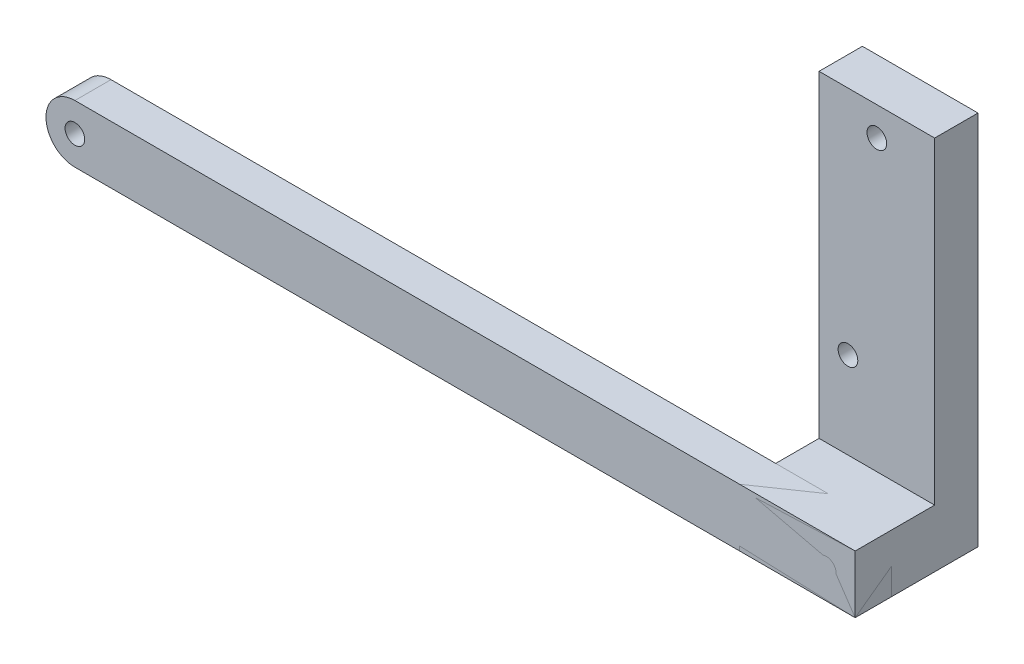
ISO-10303-21;
HEADER;
FILE_DESCRIPTION(('STEP AP214'),'2;1');
FILE_NAME('part.step','',(''),(''),'','','');
FILE_SCHEMA(('AUTOMOTIVE_DESIGN { 1 0 10303 214 1 1 1 1 }'));
ENDSEC;
DATA;
#1=APPLICATION_CONTEXT('core data for automotive mechanical design processes');
#2=APPLICATION_PROTOCOL_DEFINITION('international standard','automotive_design',2000,#1);
#3=PRODUCT_CONTEXT('',#1,'mechanical');
#4=PRODUCT('Part','Part','',(#3));
#5=PRODUCT_RELATED_PRODUCT_CATEGORY('part','',(#4));
#6=PRODUCT_DEFINITION_FORMATION('','',#4);
#7=PRODUCT_DEFINITION_CONTEXT('part definition',#1,'design');
#8=PRODUCT_DEFINITION('design','',#6,#7);
#9=PRODUCT_DEFINITION_SHAPE('','',#8);
#10=(LENGTH_UNIT() NAMED_UNIT(*) SI_UNIT(.MILLI.,.METRE.));
#11=(NAMED_UNIT(*) PLANE_ANGLE_UNIT() SI_UNIT($,.RADIAN.));
#12=(NAMED_UNIT(*) SI_UNIT($,.STERADIAN.) SOLID_ANGLE_UNIT());
#13=UNCERTAINTY_MEASURE_WITH_UNIT(LENGTH_MEASURE(1.E-05),#10,'distance_accuracy_value','');
#14=(GEOMETRIC_REPRESENTATION_CONTEXT(3) GLOBAL_UNCERTAINTY_ASSIGNED_CONTEXT((#13)) GLOBAL_UNIT_ASSIGNED_CONTEXT((#10,
#11,#12)) REPRESENTATION_CONTEXT('',''));
#15=CARTESIAN_POINT('',(0.,0.,0.));
#16=DIRECTION('',(0.,0.,1.));
#17=DIRECTION('',(1.,0.,0.));
#18=AXIS2_PLACEMENT_3D('',#15,#16,#17);
#19=CARTESIAN_POINT('',(0.,0.,-9.525));
#20=DIRECTION('',(0.,0.,-1.));
#21=DIRECTION('',(1.,0.,0.));
#22=AXIS2_PLACEMENT_3D('',#19,#20,#21);
#23=PLANE('',#22);
#24=CARTESIAN_POINT('',(-6.35,-44.45,-9.525));
#25=DIRECTION('',(0.,0.,1.));
#26=DIRECTION('',(1.,0.,0.));
#27=AXIS2_PLACEMENT_3D('',#24,#25,#26);
#28=CIRCLE('',#27,2.159);
#29=CARTESIAN_POINT('',(-8.50900000000001,-44.45,-9.525));
#30=VERTEX_POINT('',#29);
#31=EDGE_CURVE('E141',#30,#30,#28,.T.);
#32=ORIENTED_EDGE('',*,*,#31,.T.);
#33=EDGE_LOOP('',(#32));
#34=FACE_BOUND('',#33,.T.);
#35=DIRECTION('',(0.,-1.,0.));
#36=VECTOR('',#35,1.);
#37=CARTESIAN_POINT('',(-12.7,6.35,-9.525));
#38=LINE('',#37,#36);
#39=CARTESIAN_POINT('',(-12.7,6.35,-9.525));
#40=VERTEX_POINT('',#39);
#41=CARTESIAN_POINT('',(-12.7,-76.2,-9.525));
#42=VERTEX_POINT('',#41);
#43=EDGE_CURVE('E153',#40,#42,#38,.T.);
#44=ORIENTED_EDGE('',*,*,#43,.F.);
#45=DIRECTION('',(-1.,0.,0.));
#46=VECTOR('',#45,1.);
#47=CARTESIAN_POINT('',(-12.7,6.35,-9.525));
#48=LINE('',#47,#46);
#49=CARTESIAN_POINT('',(12.7,6.34999999999999,-9.525));
#50=VERTEX_POINT('',#49);
#51=EDGE_CURVE('E161',#50,#40,#48,.T.);
#52=ORIENTED_EDGE('',*,*,#51,.F.);
#53=DIRECTION('',(0.,1.,0.));
#54=VECTOR('',#53,1.);
#55=CARTESIAN_POINT('',(12.7,6.34999999999999,-9.525));
#56=LINE('',#55,#54);
#57=CARTESIAN_POINT('',(12.7,-76.2,-9.525));
#58=VERTEX_POINT('',#57);
#59=EDGE_CURVE('E158',#58,#50,#56,.T.);
#60=ORIENTED_EDGE('',*,*,#59,.F.);
#61=DIRECTION('',(1.,0.,0.));
#62=VECTOR('',#61,1.);
#63=CARTESIAN_POINT('',(-12.7,-76.2,-9.525));
#64=LINE('',#63,#62);
#65=EDGE_CURVE('E155',#42,#58,#64,.T.);
#66=ORIENTED_EDGE('',*,*,#65,.F.);
#67=EDGE_LOOP('',(#44,#52,#60,#66));
#68=FACE_BOUND('',#67,.T.);
#69=CARTESIAN_POINT('',(0.,0.,-9.525));
#70=DIRECTION('',(0.,0.,1.));
#71=DIRECTION('',(1.,0.,0.));
#72=AXIS2_PLACEMENT_3D('',#69,#70,#71);
#73=CIRCLE('',#72,2.159);
#74=CARTESIAN_POINT('',(-2.159,0.,-9.525));
#75=VERTEX_POINT('',#74);
#76=EDGE_CURVE('E147',#75,#75,#73,.T.);
#77=ORIENTED_EDGE('',*,*,#76,.T.);
#78=EDGE_LOOP('',(#77));
#79=FACE_BOUND('',#78,.T.);
#80=CARTESIAN_POINT('',(6.35,-69.85,-9.525));
#81=DIRECTION('',(0.,0.,1.));
#82=DIRECTION('',(1.,0.,0.));
#83=AXIS2_PLACEMENT_3D('',#80,#81,#82);
#84=CIRCLE('',#83,2.159);
#85=CARTESIAN_POINT('',(4.191,-69.85,-9.525));
#86=VERTEX_POINT('',#85);
#87=EDGE_CURVE('E133',#86,#86,#84,.T.);
#88=ORIENTED_EDGE('',*,*,#87,.T.);
#89=EDGE_LOOP('',(#88));
#90=FACE_BOUND('',#89,.T.);
#91=ADVANCED_FACE('F53',(#34,#68,#79,#90),#23,.T.);
#92=CARTESIAN_POINT('',(0.,0.,0.));
#93=DIRECTION('',(0.,0.,-1.));
#94=DIRECTION('',(1.,0.,0.));
#95=AXIS2_PLACEMENT_3D('',#92,#93,#94);
#96=PLANE('',#95);
#97=DIRECTION('',(0.,1.,0.));
#98=VECTOR('',#97,1.);
#99=CARTESIAN_POINT('',(12.7,6.34999999999999,0.));
#100=LINE('',#99,#98);
#101=CARTESIAN_POINT('',(12.7000000000005,-63.500000000002,0.));
#102=VERTEX_POINT('',#101);
#103=CARTESIAN_POINT('',(12.7,6.34999999999999,0.));
#104=VERTEX_POINT('',#103);
#105=EDGE_CURVE('E132',#102,#104,#100,.T.);
#106=ORIENTED_EDGE('',*,*,#105,.T.);
#107=DIRECTION('',(-1.,0.,0.));
#108=VECTOR('',#107,1.);
#109=CARTESIAN_POINT('',(-12.7,6.35,0.));
#110=LINE('',#109,#108);
#111=CARTESIAN_POINT('',(-12.7,6.35,0.));
#112=VERTEX_POINT('',#111);
#113=EDGE_CURVE('E156',#104,#112,#110,.T.);
#114=ORIENTED_EDGE('',*,*,#113,.T.);
#115=DIRECTION('',(0.,-1.,0.));
#116=VECTOR('',#115,1.);
#117=CARTESIAN_POINT('',(-12.7,6.35,0.));
#118=LINE('',#117,#116);
#119=CARTESIAN_POINT('',(-12.7,-63.500000000002,0.));
#120=VERTEX_POINT('',#119);
#121=EDGE_CURVE('E150',#112,#120,#118,.T.);
#122=ORIENTED_EDGE('',*,*,#121,.T.);
#123=DIRECTION('',(-1.,0.,0.));
#124=VECTOR('',#123,1.);
#125=CARTESIAN_POINT('',(12.7000000000005,-63.500000000002,0.));
#126=LINE('',#125,#124);
#127=EDGE_CURVE('E180',#102,#120,#126,.T.);
#128=ORIENTED_EDGE('',*,*,#127,.F.);
#129=EDGE_LOOP('',(#106,#114,#122,#128));
#130=FACE_BOUND('',#129,.T.);
#131=CARTESIAN_POINT('',(0.,0.,0.));
#132=DIRECTION('',(0.,0.,1.));
#133=DIRECTION('',(1.,0.,0.));
#134=AXIS2_PLACEMENT_3D('',#131,#132,#133);
#135=CIRCLE('',#134,2.159);
#136=CARTESIAN_POINT('',(-2.159,0.,0.));
#137=VERTEX_POINT('',#136);
#138=EDGE_CURVE('E144',#137,#137,#135,.T.);
#139=ORIENTED_EDGE('',*,*,#138,.F.);
#140=EDGE_LOOP('',(#139));
#141=FACE_BOUND('',#140,.T.);
#142=CARTESIAN_POINT('',(-6.35,-44.45,0.));
#143=DIRECTION('',(0.,0.,1.));
#144=DIRECTION('',(1.,0.,0.));
#145=AXIS2_PLACEMENT_3D('',#142,#143,#144);
#146=CIRCLE('',#145,2.159);
#147=CARTESIAN_POINT('',(-8.50900000000001,-44.45,0.));
#148=VERTEX_POINT('',#147);
#149=EDGE_CURVE('E136',#148,#148,#146,.T.);
#150=ORIENTED_EDGE('',*,*,#149,.F.);
#151=EDGE_LOOP('',(#150));
#152=FACE_BOUND('',#151,.T.);
#153=ADVANCED_FACE('F178',(#130,#141,#152),#96,.F.);
#154=CARTESIAN_POINT('',(-12.7,6.35,-9.525));
#155=DIRECTION('',(1.,0.,0.));
#156=DIRECTION('',(0.,1.,0.));
#157=AXIS2_PLACEMENT_3D('',#154,#155,#156);
#158=PLANE('',#157);
#159=ORIENTED_EDGE('',*,*,#121,.F.);
#160=DIRECTION('',(0.,0.,1.));
#161=VECTOR('',#160,1.);
#162=CARTESIAN_POINT('',(-12.7,6.35,-9.525));
#163=LINE('',#162,#161);
#164=EDGE_CURVE('E75',#40,#112,#163,.T.);
#165=ORIENTED_EDGE('',*,*,#164,.F.);
#166=ORIENTED_EDGE('',*,*,#43,.T.);
#167=DIRECTION('',(0.,0.,1.));
#168=VECTOR('',#167,1.);
#169=CARTESIAN_POINT('',(-12.7,-76.2,-9.525));
#170=LINE('',#169,#168);
#171=CARTESIAN_POINT('',(-12.7,-76.2,17.4625));
#172=VERTEX_POINT('',#171);
#173=EDGE_CURVE('E12',#42,#172,#170,.T.);
#174=ORIENTED_EDGE('',*,*,#173,.T.);
#175=DIRECTION('',(0.,-1.,0.));
#176=VECTOR('',#175,1.);
#177=CARTESIAN_POINT('',(-12.6999999999995,-63.500000000002,17.4625));
#178=LINE('',#177,#176);
#179=CARTESIAN_POINT('',(-12.6999999999995,-63.500000000002,17.4625));
#180=VERTEX_POINT('',#179);
#181=EDGE_CURVE('E118',#180,#172,#178,.T.);
#182=ORIENTED_EDGE('',*,*,#181,.F.);
#183=DIRECTION('',(0.,0.,1.));
#184=VECTOR('',#183,1.);
#185=CARTESIAN_POINT('',(-12.6999999999995,-63.500000000002,-28.3980633142469));
#186=LINE('',#185,#184);
#187=EDGE_CURVE('E68',#120,#180,#186,.T.);
#188=ORIENTED_EDGE('',*,*,#187,.F.);
#189=EDGE_LOOP('',(#159,#165,#166,#174,#182,#188));
#190=FACE_BOUND('',#189,.T.);
#191=ADVANCED_FACE('F55',(#190),#158,.F.);
#192=CARTESIAN_POINT('',(-12.7,-76.2,-9.525));
#193=DIRECTION('',(0.,1.,0.));
#194=DIRECTION('',(0.,0.,-1.));
#195=AXIS2_PLACEMENT_3D('',#192,#193,#194);
#196=PLANE('',#195);
#197=ORIENTED_EDGE('',*,*,#173,.F.);
#198=ORIENTED_EDGE('',*,*,#65,.T.);
#199=DIRECTION('',(0.,0.,1.));
#200=VECTOR('',#199,1.);
#201=CARTESIAN_POINT('',(12.7,-76.2,-9.525));
#202=LINE('',#201,#200);
#203=CARTESIAN_POINT('',(12.7000000000005,-76.2,17.4625));
#204=VERTEX_POINT('',#203);
#205=EDGE_CURVE('E61',#58,#204,#202,.T.);
#206=ORIENTED_EDGE('',*,*,#205,.T.);
#207=DIRECTION('',(1.,0.,0.));
#208=VECTOR('',#207,1.);
#209=CARTESIAN_POINT('',(12.7000000000005,-76.2,17.4625));
#210=LINE('',#209,#208);
#211=EDGE_CURVE('E124',#172,#204,#210,.T.);
#212=ORIENTED_EDGE('',*,*,#211,.F.);
#213=EDGE_LOOP('',(#197,#198,#206,#212));
#214=FACE_BOUND('',#213,.T.);
#215=ADVANCED_FACE('F170',(#214),#196,.F.);
#216=CARTESIAN_POINT('',(12.7,6.34999999999999,-9.525));
#217=DIRECTION('',(-1.,0.,0.));
#218=DIRECTION('',(0.,-1.,0.));
#219=AXIS2_PLACEMENT_3D('',#216,#217,#218);
#220=PLANE('',#219);
#221=ORIENTED_EDGE('',*,*,#205,.F.);
#222=ORIENTED_EDGE('',*,*,#59,.T.);
#223=DIRECTION('',(0.,0.,1.));
#224=VECTOR('',#223,1.);
#225=CARTESIAN_POINT('',(12.7,6.34999999999999,-9.525));
#226=LINE('',#225,#224);
#227=EDGE_CURVE('E169',#50,#104,#226,.T.);
#228=ORIENTED_EDGE('',*,*,#227,.T.);
#229=ORIENTED_EDGE('',*,*,#105,.F.);
#230=DIRECTION('',(0.,0.,1.));
#231=VECTOR('',#230,1.);
#232=CARTESIAN_POINT('',(12.7000000000005,-63.500000000002,-28.3980633142469));
#233=LINE('',#232,#231);
#234=CARTESIAN_POINT('',(12.7000000000005,-63.500000000002,17.4625));
#235=VERTEX_POINT('',#234);
#236=EDGE_CURVE('E114',#102,#235,#233,.T.);
#237=ORIENTED_EDGE('',*,*,#236,.T.);
#238=DIRECTION('',(0.,1.,0.));
#239=VECTOR('',#238,1.);
#240=CARTESIAN_POINT('',(12.7000000000005,-63.500000000002,17.4625));
#241=LINE('',#240,#239);
#242=EDGE_CURVE('E119',#204,#235,#241,.T.);
#243=ORIENTED_EDGE('',*,*,#242,.F.);
#244=EDGE_LOOP('',(#221,#222,#228,#229,#237,#243));
#245=FACE_BOUND('',#244,.T.);
#246=ADVANCED_FACE('F130',(#245),#220,.F.);
#247=CARTESIAN_POINT('',(-12.7,6.35,-9.525));
#248=DIRECTION('',(0.,-1.,0.));
#249=DIRECTION('',(1.,0.,0.));
#250=AXIS2_PLACEMENT_3D('',#247,#248,#249);
#251=PLANE('',#250);
#252=ORIENTED_EDGE('',*,*,#113,.F.);
#253=ORIENTED_EDGE('',*,*,#227,.F.);
#254=ORIENTED_EDGE('',*,*,#51,.T.);
#255=ORIENTED_EDGE('',*,*,#164,.T.);
#256=EDGE_LOOP('',(#252,#253,#254,#255));
#257=FACE_BOUND('',#256,.T.);
#258=ADVANCED_FACE('F176',(#257),#251,.F.);
#259=CARTESIAN_POINT('',(0.,0.,-9.525));
#260=DIRECTION('',(0.,0.,1.));
#261=DIRECTION('',(-1.,0.,0.));
#262=AXIS2_PLACEMENT_3D('',#259,#260,#261);
#263=CYLINDRICAL_SURFACE('',#262,2.159);
#264=CARTESIAN_POINT('',(-2.159,0.,-9.525));
#265=CARTESIAN_POINT('',(-2.159,0.,-9.42578125));
#266=CARTESIAN_POINT('',(-2.159,0.,-9.3265625));
#267=CARTESIAN_POINT('',(-2.159,0.,-9.128125));
#268=CARTESIAN_POINT('',(-2.159,0.,-9.02890625));
#269=CARTESIAN_POINT('',(-2.159,0.,-8.83046875));
#270=CARTESIAN_POINT('',(-2.159,0.,-8.73125));
#271=CARTESIAN_POINT('',(-2.159,0.,-8.5328125));
#272=CARTESIAN_POINT('',(-2.159,0.,-8.43359375));
#273=CARTESIAN_POINT('',(-2.159,0.,-8.23515625));
#274=CARTESIAN_POINT('',(-2.159,0.,-8.1359375));
#275=CARTESIAN_POINT('',(-2.159,0.,-7.9375));
#276=CARTESIAN_POINT('',(-2.159,0.,-7.83828125));
#277=CARTESIAN_POINT('',(-2.159,0.,-7.63984375));
#278=CARTESIAN_POINT('',(-2.159,0.,-7.540625));
#279=CARTESIAN_POINT('',(-2.159,0.,-7.3421875));
#280=CARTESIAN_POINT('',(-2.159,0.,-7.24296875));
#281=CARTESIAN_POINT('',(-2.159,0.,-7.04453125));
#282=CARTESIAN_POINT('',(-2.159,0.,-6.9453125));
#283=CARTESIAN_POINT('',(-2.159,0.,-6.746875));
#284=CARTESIAN_POINT('',(-2.159,0.,-6.64765625));
#285=CARTESIAN_POINT('',(-2.159,0.,-6.44921875));
#286=CARTESIAN_POINT('',(-2.159,0.,-6.35));
#287=CARTESIAN_POINT('',(-2.159,0.,-6.1515625));
#288=CARTESIAN_POINT('',(-2.159,0.,-6.05234375));
#289=CARTESIAN_POINT('',(-2.159,0.,-5.85390625));
#290=CARTESIAN_POINT('',(-2.159,0.,-5.7546875));
#291=CARTESIAN_POINT('',(-2.159,0.,-5.55625));
#292=CARTESIAN_POINT('',(-2.159,0.,-5.45703125));
#293=CARTESIAN_POINT('',(-2.159,0.,-5.25859375));
#294=CARTESIAN_POINT('',(-2.159,0.,-5.159375));
#295=CARTESIAN_POINT('',(-2.159,0.,-4.9609375));
#296=CARTESIAN_POINT('',(-2.159,0.,-4.86171875));
#297=CARTESIAN_POINT('',(-2.159,0.,-4.66328125));
#298=CARTESIAN_POINT('',(-2.159,0.,-4.5640625));
#299=CARTESIAN_POINT('',(-2.159,0.,-4.365625));
#300=CARTESIAN_POINT('',(-2.159,0.,-4.26640625));
#301=CARTESIAN_POINT('',(-2.159,0.,-4.06796875));
#302=CARTESIAN_POINT('',(-2.159,0.,-3.96875));
#303=CARTESIAN_POINT('',(-2.159,0.,-3.7703125));
#304=CARTESIAN_POINT('',(-2.159,0.,-3.67109375));
#305=CARTESIAN_POINT('',(-2.159,0.,-3.47265625));
#306=CARTESIAN_POINT('',(-2.159,0.,-3.3734375));
#307=CARTESIAN_POINT('',(-2.159,0.,-3.175));
#308=CARTESIAN_POINT('',(-2.159,0.,-3.07578125));
#309=CARTESIAN_POINT('',(-2.159,0.,-2.87734375));
#310=CARTESIAN_POINT('',(-2.159,0.,-2.778125));
#311=CARTESIAN_POINT('',(-2.159,0.,-2.5796875));
#312=CARTESIAN_POINT('',(-2.159,0.,-2.48046875));
#313=CARTESIAN_POINT('',(-2.159,0.,-2.28203125));
#314=CARTESIAN_POINT('',(-2.159,0.,-2.1828125));
#315=CARTESIAN_POINT('',(-2.159,0.,-1.984375));
#316=CARTESIAN_POINT('',(-2.159,0.,-1.88515625));
#317=CARTESIAN_POINT('',(-2.159,0.,-1.68671875));
#318=CARTESIAN_POINT('',(-2.159,0.,-1.5875));
#319=CARTESIAN_POINT('',(-2.159,0.,-1.3890625));
#320=CARTESIAN_POINT('',(-2.159,0.,-1.28984375));
#321=CARTESIAN_POINT('',(-2.159,0.,-1.09140625));
#322=CARTESIAN_POINT('',(-2.159,0.,-0.992187500000001));
#323=CARTESIAN_POINT('',(-2.159,0.,-0.793750000000001));
#324=CARTESIAN_POINT('',(-2.159,0.,-0.69453125));
#325=CARTESIAN_POINT('',(-2.159,0.,-0.49609375));
#326=CARTESIAN_POINT('',(-2.159,0.,-0.396875));
#327=CARTESIAN_POINT('',(-2.159,0.,-0.1984375));
#328=CARTESIAN_POINT('',(-2.159,0.,-0.0992187500000001));
#329=CARTESIAN_POINT('',(-2.159,0.,0.));
#330=B_SPLINE_CURVE_WITH_KNOTS('',3,(#264,#265,#266,#267,#268,#269,#270,#271,#272,#273,#274,
#275,#276,#277,#278,#279,#280,#281,#282,#283,#284,#285,#286,#287,#288,#289,#290,#291,#292,#293,
#294,#295,#296,#297,#298,#299,#300,#301,#302,#303,#304,#305,#306,#307,#308,#309,#310,#311,#312,
#313,#314,#315,#316,#317,#318,#319,#320,#321,#322,#323,#324,#325,#326,#327,#328,#329),
.UNSPECIFIED.,.F.,.F.,(4,2,2,2,2,2,2,2,2,2,2,2,2,2,2,2,2,2,2,2,2,2,2,2,2,2,2,2,2,2,2,2,4),(0.,
0.29765625,0.5953125,0.892968750000001,1.190625,1.48828125,1.7859375,2.08359375,2.38125,
2.67890625,2.9765625,3.27421875,3.571875,3.86953125,4.1671875,4.46484375,4.7625,5.06015625,
5.3578125,5.65546875,5.953125,6.25078125,6.5484375,6.84609375,7.14375,7.44140625,7.7390625,
8.03671875,8.334375,8.63203125,8.9296875,9.22734375,9.525),.UNSPECIFIED.);
#331=EDGE_CURVE('BSEAM197',#75,#137,#330,.T.);
#332=ORIENTED_EDGE('',*,*,#76,.F.);
#333=ORIENTED_EDGE('',*,*,#138,.T.);
#334=ORIENTED_EDGE('',*,*,#331,.T.);
#335=ORIENTED_EDGE('',*,*,#331,.F.);
#336=EDGE_LOOP('',(#332,#334,#333,#335));
#337=FACE_BOUND('',#336,.T.);
#338=ADVANCED_FACE('F197',(#337),#263,.F.);
#339=CARTESIAN_POINT('',(-6.35,-44.45,-9.525));
#340=DIRECTION('',(0.,0.,1.));
#341=DIRECTION('',(-1.,0.,0.));
#342=AXIS2_PLACEMENT_3D('',#339,#340,#341);
#343=CYLINDRICAL_SURFACE('',#342,2.159);
#344=CARTESIAN_POINT('',(-8.50900000000001,-44.45,-9.525));
#345=CARTESIAN_POINT('',(-8.50900000000001,-44.45,-9.42578125));
#346=CARTESIAN_POINT('',(-8.50900000000001,-44.45,-9.3265625));
#347=CARTESIAN_POINT('',(-8.50900000000001,-44.45,-9.128125));
#348=CARTESIAN_POINT('',(-8.50900000000001,-44.45,-9.02890625));
#349=CARTESIAN_POINT('',(-8.50900000000001,-44.45,-8.83046875));
#350=CARTESIAN_POINT('',(-8.50900000000001,-44.45,-8.73125));
#351=CARTESIAN_POINT('',(-8.50900000000001,-44.45,-8.5328125));
#352=CARTESIAN_POINT('',(-8.50900000000001,-44.45,-8.43359375));
#353=CARTESIAN_POINT('',(-8.50900000000001,-44.45,-8.23515625));
#354=CARTESIAN_POINT('',(-8.50900000000001,-44.45,-8.1359375));
#355=CARTESIAN_POINT('',(-8.50900000000001,-44.45,-7.9375));
#356=CARTESIAN_POINT('',(-8.50900000000001,-44.45,-7.83828125));
#357=CARTESIAN_POINT('',(-8.50900000000001,-44.45,-7.63984375));
#358=CARTESIAN_POINT('',(-8.50900000000001,-44.45,-7.540625));
#359=CARTESIAN_POINT('',(-8.50900000000001,-44.45,-7.3421875));
#360=CARTESIAN_POINT('',(-8.50900000000001,-44.45,-7.24296875));
#361=CARTESIAN_POINT('',(-8.50900000000001,-44.45,-7.04453125));
#362=CARTESIAN_POINT('',(-8.50900000000001,-44.45,-6.9453125));
#363=CARTESIAN_POINT('',(-8.50900000000001,-44.45,-6.746875));
#364=CARTESIAN_POINT('',(-8.50900000000001,-44.45,-6.64765625));
#365=CARTESIAN_POINT('',(-8.50900000000001,-44.45,-6.44921875));
#366=CARTESIAN_POINT('',(-8.50900000000001,-44.45,-6.35));
#367=CARTESIAN_POINT('',(-8.50900000000001,-44.45,-6.1515625));
#368=CARTESIAN_POINT('',(-8.50900000000001,-44.45,-6.05234375));
#369=CARTESIAN_POINT('',(-8.50900000000001,-44.45,-5.85390625));
#370=CARTESIAN_POINT('',(-8.50900000000001,-44.45,-5.7546875));
#371=CARTESIAN_POINT('',(-8.50900000000001,-44.45,-5.55625));
#372=CARTESIAN_POINT('',(-8.50900000000001,-44.45,-5.45703125));
#373=CARTESIAN_POINT('',(-8.50900000000001,-44.45,-5.25859375));
#374=CARTESIAN_POINT('',(-8.50900000000001,-44.45,-5.159375));
#375=CARTESIAN_POINT('',(-8.50900000000001,-44.45,-4.9609375));
#376=CARTESIAN_POINT('',(-8.50900000000001,-44.45,-4.86171875));
#377=CARTESIAN_POINT('',(-8.50900000000001,-44.45,-4.66328125));
#378=CARTESIAN_POINT('',(-8.50900000000001,-44.45,-4.5640625));
#379=CARTESIAN_POINT('',(-8.50900000000001,-44.45,-4.365625));
#380=CARTESIAN_POINT('',(-8.50900000000001,-44.45,-4.26640625));
#381=CARTESIAN_POINT('',(-8.50900000000001,-44.45,-4.06796875));
#382=CARTESIAN_POINT('',(-8.50900000000001,-44.45,-3.96875));
#383=CARTESIAN_POINT('',(-8.50900000000001,-44.45,-3.7703125));
#384=CARTESIAN_POINT('',(-8.50900000000001,-44.45,-3.67109375));
#385=CARTESIAN_POINT('',(-8.50900000000001,-44.45,-3.47265625));
#386=CARTESIAN_POINT('',(-8.50900000000001,-44.45,-3.3734375));
#387=CARTESIAN_POINT('',(-8.50900000000001,-44.45,-3.175));
#388=CARTESIAN_POINT('',(-8.50900000000001,-44.45,-3.07578125));
#389=CARTESIAN_POINT('',(-8.50900000000001,-44.45,-2.87734375));
#390=CARTESIAN_POINT('',(-8.50900000000001,-44.45,-2.778125));
#391=CARTESIAN_POINT('',(-8.50900000000001,-44.45,-2.5796875));
#392=CARTESIAN_POINT('',(-8.50900000000001,-44.45,-2.48046875));
#393=CARTESIAN_POINT('',(-8.50900000000001,-44.45,-2.28203125));
#394=CARTESIAN_POINT('',(-8.50900000000001,-44.45,-2.1828125));
#395=CARTESIAN_POINT('',(-8.50900000000001,-44.45,-1.984375));
#396=CARTESIAN_POINT('',(-8.50900000000001,-44.45,-1.88515625));
#397=CARTESIAN_POINT('',(-8.50900000000001,-44.45,-1.68671875));
#398=CARTESIAN_POINT('',(-8.50900000000001,-44.45,-1.5875));
#399=CARTESIAN_POINT('',(-8.50900000000001,-44.45,-1.3890625));
#400=CARTESIAN_POINT('',(-8.50900000000001,-44.45,-1.28984375));
#401=CARTESIAN_POINT('',(-8.50900000000001,-44.45,-1.09140625));
#402=CARTESIAN_POINT('',(-8.50900000000001,-44.45,-0.992187500000001));
#403=CARTESIAN_POINT('',(-8.50900000000001,-44.45,-0.793750000000001));
#404=CARTESIAN_POINT('',(-8.50900000000001,-44.45,-0.69453125));
#405=CARTESIAN_POINT('',(-8.50900000000001,-44.45,-0.49609375));
#406=CARTESIAN_POINT('',(-8.50900000000001,-44.45,-0.396875));
#407=CARTESIAN_POINT('',(-8.50900000000001,-44.45,-0.1984375));
#408=CARTESIAN_POINT('',(-8.50900000000001,-44.45,-0.0992187500000001));
#409=CARTESIAN_POINT('',(-8.50900000000001,-44.45,0.));
#410=B_SPLINE_CURVE_WITH_KNOTS('',3,(#344,#345,#346,#347,#348,#349,#350,#351,#352,#353,#354,
#355,#356,#357,#358,#359,#360,#361,#362,#363,#364,#365,#366,#367,#368,#369,#370,#371,#372,#373,
#374,#375,#376,#377,#378,#379,#380,#381,#382,#383,#384,#385,#386,#387,#388,#389,#390,#391,#392,
#393,#394,#395,#396,#397,#398,#399,#400,#401,#402,#403,#404,#405,#406,#407,#408,#409),
.UNSPECIFIED.,.F.,.F.,(4,2,2,2,2,2,2,2,2,2,2,2,2,2,2,2,2,2,2,2,2,2,2,2,2,2,2,2,2,2,2,2,4),(0.,
0.29765625,0.5953125,0.892968750000001,1.190625,1.48828125,1.7859375,2.08359375,2.38125,
2.67890625,2.9765625,3.27421875,3.571875,3.86953125,4.1671875,4.46484375,4.7625,5.06015625,
5.3578125,5.65546875,5.953125,6.25078125,6.5484375,6.84609375,7.14375,7.44140625,7.7390625,
8.03671875,8.334375,8.63203125,8.9296875,9.22734375,9.525),.UNSPECIFIED.);
#411=EDGE_CURVE('BSEAM219',#30,#148,#410,.T.);
#412=ORIENTED_EDGE('',*,*,#31,.F.);
#413=ORIENTED_EDGE('',*,*,#149,.T.);
#414=ORIENTED_EDGE('',*,*,#411,.T.);
#415=ORIENTED_EDGE('',*,*,#411,.F.);
#416=EDGE_LOOP('',(#412,#414,#413,#415));
#417=FACE_BOUND('',#416,.T.);
#418=ADVANCED_FACE('F219',(#417),#343,.F.);
#419=CARTESIAN_POINT('',(6.35,-69.85,-9.525));
#420=DIRECTION('',(0.,0.,1.));
#421=DIRECTION('',(-1.,0.,0.));
#422=AXIS2_PLACEMENT_3D('',#419,#420,#421);
#423=CYLINDRICAL_SURFACE('',#422,2.159);
#424=CARTESIAN_POINT('',(6.35,-69.85,17.4625));
#425=DIRECTION('',(0.,0.,1.));
#426=DIRECTION('',(1.,0.,0.));
#427=AXIS2_PLACEMENT_3D('',#424,#425,#426);
#428=CIRCLE('',#427,2.15899999999988);
#429=CARTESIAN_POINT('',(4.191,-69.85,17.4625));
#430=VERTEX_POINT('',#429);
#431=EDGE_CURVE('E127',#430,#430,#428,.T.);
#432=CARTESIAN_POINT('',(4.191,-69.85,-9.525));
#433=CARTESIAN_POINT('',(4.191,-69.85,-9.24388020833334));
#434=CARTESIAN_POINT('',(4.191,-69.85,-8.96276041666667));
#435=CARTESIAN_POINT('',(4.191,-69.85,-8.40052083333333));
#436=CARTESIAN_POINT('',(4.191,-69.85,-8.11940104166667));
#437=CARTESIAN_POINT('',(4.191,-69.85,-7.55716145833333));
#438=CARTESIAN_POINT('',(4.191,-69.85,-7.27604166666667));
#439=CARTESIAN_POINT('',(4.191,-69.85,-6.71380208333333));
#440=CARTESIAN_POINT('',(4.191,-69.85,-6.43268229166667));
#441=CARTESIAN_POINT('',(4.191,-69.85,-5.87044270833333));
#442=CARTESIAN_POINT('',(4.191,-69.85,-5.58932291666667));
#443=CARTESIAN_POINT('',(4.191,-69.85,-5.02708333333333));
#444=CARTESIAN_POINT('',(4.191,-69.85,-4.74596354166667));
#445=CARTESIAN_POINT('',(4.191,-69.85,-4.18372395833333));
#446=CARTESIAN_POINT('',(4.191,-69.85,-3.90260416666667));
#447=CARTESIAN_POINT('',(4.191,-69.85,-3.34036458333333));
#448=CARTESIAN_POINT('',(4.191,-69.85,-3.05924479166667));
#449=CARTESIAN_POINT('',(4.191,-69.85,-2.49700520833333));
#450=CARTESIAN_POINT('',(4.191,-69.85,-2.21588541666667));
#451=CARTESIAN_POINT('',(4.191,-69.85,-1.65364583333334));
#452=CARTESIAN_POINT('',(4.191,-69.85,-1.37252604166667));
#453=CARTESIAN_POINT('',(4.191,-69.85,-0.810286458333336));
#454=CARTESIAN_POINT('',(4.191,-69.85,-0.52916666666667));
#455=CARTESIAN_POINT('',(4.191,-69.85,0.0330729166666642));
#456=CARTESIAN_POINT('',(4.191,-69.85,0.314192708333331));
#457=CARTESIAN_POINT('',(4.191,-69.85,0.876432291666665));
#458=CARTESIAN_POINT('',(4.191,-69.85,1.15755208333333));
#459=CARTESIAN_POINT('',(4.191,-69.85,1.71979166666667));
#460=CARTESIAN_POINT('',(4.191,-69.85,2.00091145833333));
#461=CARTESIAN_POINT('',(4.191,-69.85,2.56315104166667));
#462=CARTESIAN_POINT('',(4.191,-69.85,2.84427083333333));
#463=CARTESIAN_POINT('',(4.191,-69.85,3.40651041666667));
#464=CARTESIAN_POINT('',(4.191,-69.85,3.68763020833333));
#465=CARTESIAN_POINT('',(4.191,-69.85,4.24986979166667));
#466=CARTESIAN_POINT('',(4.191,-69.85,4.53098958333333));
#467=CARTESIAN_POINT('',(4.191,-69.85,5.09322916666667));
#468=CARTESIAN_POINT('',(4.191,-69.85,5.37434895833333));
#469=CARTESIAN_POINT('',(4.191,-69.85,5.93658854166666));
#470=CARTESIAN_POINT('',(4.191,-69.85,6.21770833333333));
#471=CARTESIAN_POINT('',(4.191,-69.85,6.77994791666667));
#472=CARTESIAN_POINT('',(4.191,-69.85,7.06106770833333));
#473=CARTESIAN_POINT('',(4.191,-69.85,7.62330729166666));
#474=CARTESIAN_POINT('',(4.191,-69.85,7.90442708333333));
#475=CARTESIAN_POINT('',(4.191,-69.85,8.46666666666667));
#476=CARTESIAN_POINT('',(4.191,-69.85,8.74778645833333));
#477=CARTESIAN_POINT('',(4.191,-69.85,9.31002604166667));
#478=CARTESIAN_POINT('',(4.191,-69.85,9.59114583333333));
#479=CARTESIAN_POINT('',(4.191,-69.85,10.1533854166667));
#480=CARTESIAN_POINT('',(4.191,-69.85,10.4345052083333));
#481=CARTESIAN_POINT('',(4.191,-69.85,10.9967447916667));
#482=CARTESIAN_POINT('',(4.191,-69.85,11.2778645833333));
#483=CARTESIAN_POINT('',(4.191,-69.85,11.8401041666667));
#484=CARTESIAN_POINT('',(4.191,-69.85,12.1212239583333));
#485=CARTESIAN_POINT('',(4.191,-69.85,12.6834635416667));
#486=CARTESIAN_POINT('',(4.191,-69.85,12.9645833333333));
#487=CARTESIAN_POINT('',(4.191,-69.85,13.5268229166667));
#488=CARTESIAN_POINT('',(4.191,-69.85,13.8079427083333));
#489=CARTESIAN_POINT('',(4.191,-69.85,14.3701822916667));
#490=CARTESIAN_POINT('',(4.191,-69.85,14.6513020833333));
#491=CARTESIAN_POINT('',(4.191,-69.85,15.2135416666667));
#492=CARTESIAN_POINT('',(4.191,-69.85,15.4946614583333));
#493=CARTESIAN_POINT('',(4.191,-69.85,16.0569010416667));
#494=CARTESIAN_POINT('',(4.191,-69.85,16.3380208333333));
#495=CARTESIAN_POINT('',(4.191,-69.85,16.9002604166667));
#496=CARTESIAN_POINT('',(4.191,-69.85,17.1813802083333));
#497=CARTESIAN_POINT('',(4.191,-69.85,17.4625));
#498=B_SPLINE_CURVE_WITH_KNOTS('',3,(#432,#433,#434,#435,#436,#437,#438,#439,#440,#441,#442,
#443,#444,#445,#446,#447,#448,#449,#450,#451,#452,#453,#454,#455,#456,#457,#458,#459,#460,#461,
#462,#463,#464,#465,#466,#467,#468,#469,#470,#471,#472,#473,#474,#475,#476,#477,#478,#479,#480,
#481,#482,#483,#484,#485,#486,#487,#488,#489,#490,#491,#492,#493,#494,#495,#496,#497),
.UNSPECIFIED.,.F.,.F.,(4,2,2,2,2,2,2,2,2,2,2,2,2,2,2,2,2,2,2,2,2,2,2,2,2,2,2,2,2,2,2,2,4),(0.,
0.843359375000002,1.68671875,2.530078125,3.3734375,4.216796875,5.06015625,5.903515625,6.746875,
7.590234375,8.43359375,9.276953125,10.1203125,10.963671875,11.80703125,12.650390625,13.49375,
14.337109375,15.18046875,16.023828125,16.8671875,17.710546875,18.55390625,19.397265625,
20.240625,21.083984375,21.92734375,22.770703125,23.6140625,24.457421875,25.30078125,
26.144140625,26.9875),.UNSPECIFIED.);
#499=EDGE_CURVE('BSEAM227',#86,#430,#498,.T.);
#500=ORIENTED_EDGE('',*,*,#87,.F.);
#501=ORIENTED_EDGE('',*,*,#431,.T.);
#502=ORIENTED_EDGE('',*,*,#499,.T.);
#503=ORIENTED_EDGE('',*,*,#499,.F.);
#504=EDGE_LOOP('',(#500,#502,#501,#503));
#505=FACE_BOUND('',#504,.T.);
#506=ADVANCED_FACE('F227',(#505),#423,.F.);
#507=CARTESIAN_POINT('',(12.7000000000005,-63.500000000002,-28.3980633142469));
#508=DIRECTION('',(0.,-1.,0.));
#509=DIRECTION('',(0.,0.,1.));
#510=AXIS2_PLACEMENT_3D('',#507,#508,#509);
#511=PLANE('',#510);
#512=ORIENTED_EDGE('',*,*,#127,.T.);
#513=ORIENTED_EDGE('',*,*,#187,.T.);
#514=DIRECTION('',(-1.,0.,0.));
#515=VECTOR('',#514,1.);
#516=CARTESIAN_POINT('',(12.7000000000005,-63.500000000002,17.4625));
#517=LINE('',#516,#515);
#518=EDGE_CURVE('E110',#235,#180,#517,.T.);
#519=ORIENTED_EDGE('',*,*,#518,.F.);
#520=ORIENTED_EDGE('',*,*,#236,.F.);
#521=EDGE_LOOP('',(#512,#513,#519,#520));
#522=FACE_BOUND('',#521,.T.);
#523=ADVANCED_FACE('F112',(#522),#511,.F.);
#524=CARTESIAN_POINT('',(0.,0.,17.4625));
#525=DIRECTION('',(0.,0.,1.));
#526=DIRECTION('',(-1.,0.,0.));
#527=AXIS2_PLACEMENT_3D('',#524,#525,#526);
#528=PLANE('',#527);
#529=ORIENTED_EDGE('',*,*,#242,.T.);
#530=ORIENTED_EDGE('',*,*,#518,.T.);
#531=ORIENTED_EDGE('',*,*,#181,.T.);
#532=ORIENTED_EDGE('',*,*,#211,.T.);
#533=EDGE_LOOP('',(#529,#530,#531,#532));
#534=FACE_BOUND('',#533,.T.);
#535=ORIENTED_EDGE('',*,*,#431,.F.);
#536=EDGE_LOOP('',(#535));
#537=FACE_BOUND('',#536,.T.);
#538=ADVANCED_FACE('F122',(#534,#537),#528,.T.);
#539=CLOSED_SHELL('',(#91,#153,#191,#215,#246,#258,#338,#418,#506,#523,#538));
#540=MANIFOLD_SOLID_BREP('B2',#539);
#541=CARTESIAN_POINT('',(-158.75,-69.850000000002,9.525));
#542=DIRECTION('',(0.,0.,-1.));
#543=DIRECTION('',(1.,0.,0.));
#544=AXIS2_PLACEMENT_3D('',#541,#542,#543);
#545=PLANE('',#544);
#546=CARTESIAN_POINT('',(-158.75,-69.850000000002,9.525));
#547=DIRECTION('',(0.,0.,1.));
#548=DIRECTION('',(1.,0.,0.));
#549=AXIS2_PLACEMENT_3D('',#546,#547,#548);
#550=CIRCLE('',#549,6.34999999999999);
#551=CARTESIAN_POINT('',(-158.75,-63.500000000002,9.525));
#552=VERTEX_POINT('',#551);
#553=CARTESIAN_POINT('',(-158.75,-76.2000000000019,9.525));
#554=VERTEX_POINT('',#553);
#555=EDGE_CURVE('E360',#552,#554,#550,.T.);
#556=ORIENTED_EDGE('',*,*,#555,.F.);
#557=DIRECTION('',(-1.,0.,0.));
#558=VECTOR('',#557,1.);
#559=CARTESIAN_POINT('',(12.7000000000005,-63.500000000002,9.525));
#560=LINE('',#559,#558);
#561=CARTESIAN_POINT('',(12.7000000000005,-63.500000000002,9.525));
#562=VERTEX_POINT('',#561);
#563=EDGE_CURVE('E363',#562,#552,#560,.T.);
#564=ORIENTED_EDGE('',*,*,#563,.F.);
#565=DIRECTION('',(0.,1.,0.));
#566=VECTOR('',#565,1.);
#567=CARTESIAN_POINT('',(12.7,-76.2,9.525));
#568=LINE('',#567,#566);
#569=CARTESIAN_POINT('',(12.7,-76.2,9.525));
#570=VERTEX_POINT('',#569);
#571=EDGE_CURVE('E351',#570,#562,#568,.T.);
#572=ORIENTED_EDGE('',*,*,#571,.F.);
#573=DIRECTION('',(1.,0.,0.));
#574=VECTOR('',#573,1.);
#575=CARTESIAN_POINT('',(-158.75,-76.2000000000019,9.525));
#576=LINE('',#575,#574);
#577=EDGE_CURVE('E356',#554,#570,#576,.T.);
#578=ORIENTED_EDGE('',*,*,#577,.F.);
#579=EDGE_LOOP('',(#556,#564,#572,#578));
#580=FACE_BOUND('',#579,.T.);
#581=CARTESIAN_POINT('',(-158.75,-69.850000000002,9.525));
#582=DIRECTION('',(0.,0.,1.));
#583=DIRECTION('',(1.,0.,0.));
#584=AXIS2_PLACEMENT_3D('',#581,#582,#583);
#585=CIRCLE('',#584,2.15899999999999);
#586=CARTESIAN_POINT('',(-156.591,-69.850000000002,9.525));
#587=VERTEX_POINT('',#586);
#588=EDGE_CURVE('E372',#587,#587,#585,.T.);
#589=ORIENTED_EDGE('',*,*,#588,.T.);
#590=EDGE_LOOP('',(#589));
#591=FACE_BOUND('',#590,.T.);
#592=ADVANCED_FACE('F304',(#580,#591),#545,.T.);
#593=CARTESIAN_POINT('',(-158.75,-69.850000000002,17.4625));
#594=DIRECTION('',(0.,0.,-1.));
#595=DIRECTION('',(1.,0.,0.));
#596=AXIS2_PLACEMENT_3D('',#593,#594,#595);
#597=PLANE('',#596);
#598=CARTESIAN_POINT('',(-158.75,-69.850000000002,17.4625));
#599=DIRECTION('',(0.,0.,1.));
#600=DIRECTION('',(1.,0.,0.));
#601=AXIS2_PLACEMENT_3D('',#598,#599,#600);
#602=CIRCLE('',#601,6.34999999999999);
#603=CARTESIAN_POINT('',(-158.75,-63.500000000002,17.4625));
#604=VERTEX_POINT('',#603);
#605=CARTESIAN_POINT('',(-158.75,-76.2000000000019,17.4625));
#606=VERTEX_POINT('',#605);
#607=EDGE_CURVE('E368',#604,#606,#602,.T.);
#608=ORIENTED_EDGE('',*,*,#607,.T.);
#609=DIRECTION('',(1.,0.,0.));
#610=VECTOR('',#609,1.);
#611=CARTESIAN_POINT('',(-158.75,-76.2000000000019,17.4625));
#612=LINE('',#611,#610);
#613=CARTESIAN_POINT('',(12.7,-76.2,17.4625));
#614=VERTEX_POINT('',#613);
#615=EDGE_CURVE('E371',#606,#614,#612,.T.);
#616=ORIENTED_EDGE('',*,*,#615,.T.);
#617=DIRECTION('',(0.,1.,0.));
#618=VECTOR('',#617,1.);
#619=CARTESIAN_POINT('',(12.7,-76.2,17.4625));
#620=LINE('',#619,#618);
#621=CARTESIAN_POINT('',(12.7000000000005,-63.500000000002,17.4625));
#622=VERTEX_POINT('',#621);
#623=EDGE_CURVE('E354',#614,#622,#620,.T.);
#624=ORIENTED_EDGE('',*,*,#623,.T.);
#625=DIRECTION('',(-1.,0.,0.));
#626=VECTOR('',#625,1.);
#627=CARTESIAN_POINT('',(12.7000000000005,-63.500000000002,17.4625));
#628=LINE('',#627,#626);
#629=EDGE_CURVE('E375',#622,#604,#628,.T.);
#630=ORIENTED_EDGE('',*,*,#629,.T.);
#631=EDGE_LOOP('',(#608,#616,#624,#630));
#632=FACE_BOUND('',#631,.T.);
#633=CARTESIAN_POINT('',(-158.75,-69.850000000002,17.4625));
#634=DIRECTION('',(0.,0.,1.));
#635=DIRECTION('',(1.,0.,0.));
#636=AXIS2_PLACEMENT_3D('',#633,#634,#635);
#637=CIRCLE('',#636,2.15899999999999);
#638=CARTESIAN_POINT('',(-156.591,-69.850000000002,17.4625));
#639=VERTEX_POINT('',#638);
#640=EDGE_CURVE('E380',#639,#639,#637,.T.);
#641=ORIENTED_EDGE('',*,*,#640,.F.);
#642=EDGE_LOOP('',(#641));
#643=FACE_BOUND('',#642,.T.);
#644=ADVANCED_FACE('F393',(#632,#643),#597,.F.);
#645=CARTESIAN_POINT('',(-158.75,-69.850000000002,9.525));
#646=DIRECTION('',(0.,0.,1.));
#647=DIRECTION('',(-1.,0.,0.));
#648=AXIS2_PLACEMENT_3D('',#645,#646,#647);
#649=CYLINDRICAL_SURFACE('',#648,6.34999999999999);
#650=ORIENTED_EDGE('',*,*,#607,.F.);
#651=DIRECTION('',(0.,0.,1.));
#652=VECTOR('',#651,1.);
#653=CARTESIAN_POINT('',(-158.75,-63.500000000002,9.525));
#654=LINE('',#653,#652);
#655=EDGE_CURVE('E321',#552,#604,#654,.T.);
#656=ORIENTED_EDGE('',*,*,#655,.F.);
#657=ORIENTED_EDGE('',*,*,#555,.T.);
#658=DIRECTION('',(0.,0.,1.));
#659=VECTOR('',#658,1.);
#660=CARTESIAN_POINT('',(-158.75,-76.2000000000019,9.525));
#661=LINE('',#660,#659);
#662=EDGE_CURVE('E51',#554,#606,#661,.T.);
#663=ORIENTED_EDGE('',*,*,#662,.T.);
#664=EDGE_LOOP('',(#650,#656,#657,#663));
#665=FACE_BOUND('',#664,.T.);
#666=ADVANCED_FACE('F306',(#665),#649,.T.);
#667=CARTESIAN_POINT('',(-158.75,-76.2000000000019,9.525));
#668=DIRECTION('',(0.,1.,0.));
#669=DIRECTION('',(-1.,0.,0.));
#670=AXIS2_PLACEMENT_3D('',#667,#668,#669);
#671=PLANE('',#670);
#672=ORIENTED_EDGE('',*,*,#615,.F.);
#673=ORIENTED_EDGE('',*,*,#662,.F.);
#674=ORIENTED_EDGE('',*,*,#577,.T.);
#675=DIRECTION('',(0.,0.,1.));
#676=VECTOR('',#675,1.);
#677=CARTESIAN_POINT('',(12.7,-76.2,9.525));
#678=LINE('',#677,#676);
#679=EDGE_CURVE('E313',#570,#614,#678,.T.);
#680=ORIENTED_EDGE('',*,*,#679,.T.);
#681=EDGE_LOOP('',(#672,#673,#674,#680));
#682=FACE_BOUND('',#681,.T.);
#683=ADVANCED_FACE('F357',(#682),#671,.F.);
#684=CARTESIAN_POINT('',(12.7,-76.2,9.525));
#685=DIRECTION('',(-1.,0.,0.));
#686=DIRECTION('',(0.,-1.,0.));
#687=AXIS2_PLACEMENT_3D('',#684,#685,#686);
#688=PLANE('',#687);
#689=ORIENTED_EDGE('',*,*,#623,.F.);
#690=ORIENTED_EDGE('',*,*,#679,.F.);
#691=ORIENTED_EDGE('',*,*,#571,.T.);
#692=DIRECTION('',(0.,0.,1.));
#693=VECTOR('',#692,1.);
#694=CARTESIAN_POINT('',(12.7000000000005,-63.500000000002,9.525));
#695=LINE('',#694,#693);
#696=EDGE_CURVE('E337',#562,#622,#695,.T.);
#697=ORIENTED_EDGE('',*,*,#696,.T.);
#698=EDGE_LOOP('',(#689,#690,#691,#697));
#699=FACE_BOUND('',#698,.T.);
#700=ADVANCED_FACE('F349',(#699),#688,.F.);
#701=CARTESIAN_POINT('',(12.7000000000005,-63.500000000002,9.525));
#702=DIRECTION('',(0.,-1.,0.));
#703=DIRECTION('',(0.,0.,1.));
#704=AXIS2_PLACEMENT_3D('',#701,#702,#703);
#705=PLANE('',#704);
#706=ORIENTED_EDGE('',*,*,#629,.F.);
#707=ORIENTED_EDGE('',*,*,#696,.F.);
#708=ORIENTED_EDGE('',*,*,#563,.T.);
#709=ORIENTED_EDGE('',*,*,#655,.T.);
#710=EDGE_LOOP('',(#706,#707,#708,#709));
#711=FACE_BOUND('',#710,.T.);
#712=ADVANCED_FACE('F389',(#711),#705,.F.);
#713=CARTESIAN_POINT('',(-158.75,-69.850000000002,9.525));
#714=DIRECTION('',(0.,0.,1.));
#715=DIRECTION('',(-1.,0.,0.));
#716=AXIS2_PLACEMENT_3D('',#713,#714,#715);
#717=CYLINDRICAL_SURFACE('',#716,2.15899999999999);
#718=ORIENTED_EDGE('',*,*,#588,.F.);
#719=EDGE_LOOP('',(#718));
#720=FACE_BOUND('',#719,.T.);
#721=ORIENTED_EDGE('',*,*,#640,.T.);
#722=EDGE_LOOP('',(#721));
#723=FACE_BOUND('',#722,.T.);
#724=ADVANCED_FACE('F386',(#720,#723),#717,.F.);
#725=CLOSED_SHELL('',(#592,#644,#666,#683,#700,#712,#724));
#726=MANIFOLD_SOLID_BREP('B6',#725);
#727=ADVANCED_BREP_SHAPE_REPRESENTATION('',(#18,#540,#726),#14);
#728=SHAPE_DEFINITION_REPRESENTATION(#9,#727);
ENDSEC;
END-ISO-10303-21;
